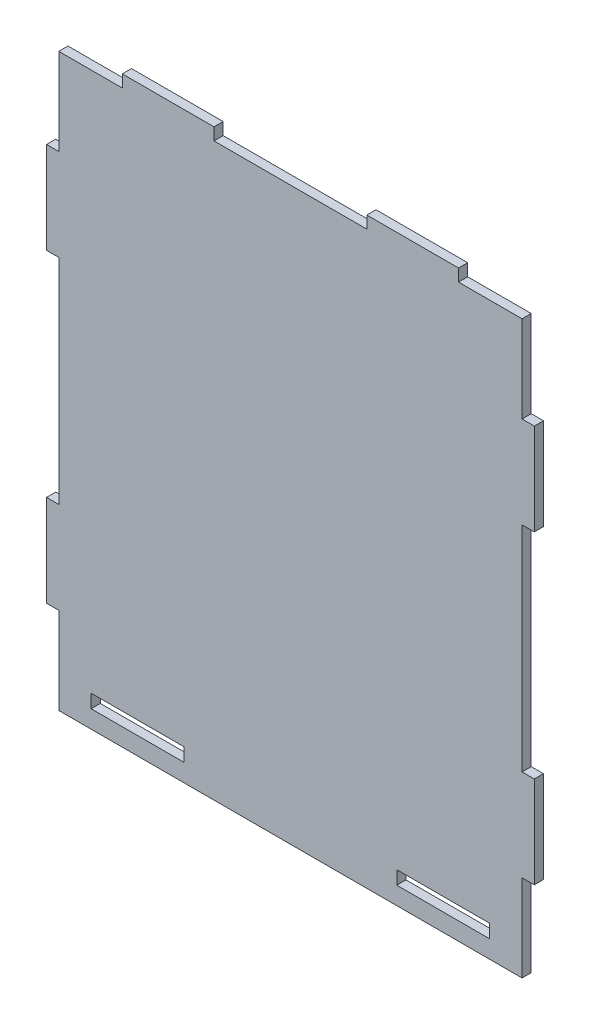
ISO-10303-21;
HEADER;
FILE_DESCRIPTION(('STEP AP214'),'2;1');
FILE_NAME('part.step','',(''),(''),'','','');
FILE_SCHEMA(('AUTOMOTIVE_DESIGN { 1 0 10303 214 1 1 1 1 }'));
ENDSEC;
DATA;
#1=APPLICATION_CONTEXT('core data for automotive mechanical design processes');
#2=APPLICATION_PROTOCOL_DEFINITION('international standard','automotive_design',2000,#1);
#3=PRODUCT_CONTEXT('',#1,'mechanical');
#4=PRODUCT('Part','Part','',(#3));
#5=PRODUCT_RELATED_PRODUCT_CATEGORY('part','',(#4));
#6=PRODUCT_DEFINITION_FORMATION('','',#4);
#7=PRODUCT_DEFINITION_CONTEXT('part definition',#1,'design');
#8=PRODUCT_DEFINITION('design','',#6,#7);
#9=PRODUCT_DEFINITION_SHAPE('','',#8);
#10=(LENGTH_UNIT() NAMED_UNIT(*) SI_UNIT(.MILLI.,.METRE.));
#11=(NAMED_UNIT(*) PLANE_ANGLE_UNIT() SI_UNIT($,.RADIAN.));
#12=(NAMED_UNIT(*) SI_UNIT($,.STERADIAN.) SOLID_ANGLE_UNIT());
#13=UNCERTAINTY_MEASURE_WITH_UNIT(LENGTH_MEASURE(1.E-05),#10,'distance_accuracy_value','');
#14=(GEOMETRIC_REPRESENTATION_CONTEXT(3) GLOBAL_UNCERTAINTY_ASSIGNED_CONTEXT((#13)) GLOBAL_UNIT_ASSIGNED_CONTEXT((#10,
#11,#12)) REPRESENTATION_CONTEXT('',''));
#15=CARTESIAN_POINT('',(0.,0.,0.));
#16=DIRECTION('',(0.,0.,1.));
#17=DIRECTION('',(1.,0.,0.));
#18=AXIS2_PLACEMENT_3D('',#15,#16,#17);
#19=CARTESIAN_POINT('',(0.,0.,3.));
#20=DIRECTION('',(0.,1.,0.));
#21=DIRECTION('',(0.,0.,1.));
#22=AXIS2_PLACEMENT_3D('',#19,#20,#21);
#23=PLANE('',#22);
#24=DIRECTION('',(1.,0.,0.));
#25=VECTOR('',#24,1.);
#26=CARTESIAN_POINT('',(0.,0.,0.));
#27=LINE('',#26,#25);
#28=CARTESIAN_POINT('',(0.,0.,0.));
#29=VERTEX_POINT('',#28);
#30=CARTESIAN_POINT('',(151.6,0.,0.));
#31=VERTEX_POINT('',#30);
#32=EDGE_CURVE('E332',#29,#31,#27,.T.);
#33=ORIENTED_EDGE('',*,*,#32,.T.);
#34=DIRECTION('',(0.,0.,-1.));
#35=VECTOR('',#34,1.);
#36=CARTESIAN_POINT('',(151.6,0.,3.));
#37=LINE('',#36,#35);
#38=CARTESIAN_POINT('',(151.6,0.,3.));
#39=VERTEX_POINT('',#38);
#40=EDGE_CURVE('E11',#39,#31,#37,.T.);
#41=ORIENTED_EDGE('',*,*,#40,.F.);
#42=DIRECTION('',(1.,0.,0.));
#43=VECTOR('',#42,1.);
#44=CARTESIAN_POINT('',(0.,0.,3.));
#45=LINE('',#44,#43);
#46=CARTESIAN_POINT('',(0.,0.,3.));
#47=VERTEX_POINT('',#46);
#48=EDGE_CURVE('E499',#47,#39,#45,.T.);
#49=ORIENTED_EDGE('',*,*,#48,.F.);
#50=DIRECTION('',(0.,0.,-1.));
#51=VECTOR('',#50,1.);
#52=CARTESIAN_POINT('',(0.,0.,3.));
#53=LINE('',#52,#51);
#54=EDGE_CURVE('E56',#47,#29,#53,.T.);
#55=ORIENTED_EDGE('',*,*,#54,.T.);
#56=EDGE_LOOP('',(#33,#41,#49,#55));
#57=FACE_BOUND('',#56,.T.);
#58=ADVANCED_FACE('F37',(#57),#23,.F.);
#59=CARTESIAN_POINT('',(151.6,0.,3.));
#60=DIRECTION('',(-1.,0.,0.));
#61=DIRECTION('',(0.,0.,1.));
#62=AXIS2_PLACEMENT_3D('',#59,#60,#61);
#63=PLANE('',#62);
#64=DIRECTION('',(0.,1.,0.));
#65=VECTOR('',#64,1.);
#66=CARTESIAN_POINT('',(151.6,0.,0.));
#67=LINE('',#66,#65);
#68=CARTESIAN_POINT('',(151.6,28.4,0.));
#69=VERTEX_POINT('',#68);
#70=EDGE_CURVE('E334',#31,#69,#67,.T.);
#71=ORIENTED_EDGE('',*,*,#70,.T.);
#72=DIRECTION('',(0.,0.,-1.));
#73=VECTOR('',#72,1.);
#74=CARTESIAN_POINT('',(151.6,28.4,3.));
#75=LINE('',#74,#73);
#76=CARTESIAN_POINT('',(151.6,28.4,3.));
#77=VERTEX_POINT('',#76);
#78=EDGE_CURVE('E47',#77,#69,#75,.T.);
#79=ORIENTED_EDGE('',*,*,#78,.F.);
#80=DIRECTION('',(0.,1.,0.));
#81=VECTOR('',#80,1.);
#82=CARTESIAN_POINT('',(151.6,0.,3.));
#83=LINE('',#82,#81);
#84=EDGE_CURVE('E501',#39,#77,#83,.T.);
#85=ORIENTED_EDGE('',*,*,#84,.F.);
#86=ORIENTED_EDGE('',*,*,#40,.T.);
#87=EDGE_LOOP('',(#71,#79,#85,#86));
#88=FACE_BOUND('',#87,.T.);
#89=ADVANCED_FACE('F592',(#88),#63,.F.);
#90=CARTESIAN_POINT('',(0.,28.4,3.));
#91=DIRECTION('',(0.,1.,0.));
#92=DIRECTION('',(0.,0.,1.));
#93=AXIS2_PLACEMENT_3D('',#90,#91,#92);
#94=PLANE('',#93);
#95=DIRECTION('',(1.,0.,0.));
#96=VECTOR('',#95,1.);
#97=CARTESIAN_POINT('',(0.,28.4,0.));
#98=LINE('',#97,#96);
#99=CARTESIAN_POINT('',(155.6,28.4,0.));
#100=VERTEX_POINT('',#99);
#101=EDGE_CURVE('E336',#69,#100,#98,.T.);
#102=ORIENTED_EDGE('',*,*,#101,.T.);
#103=DIRECTION('',(0.,0.,-1.));
#104=VECTOR('',#103,1.);
#105=CARTESIAN_POINT('',(155.6,28.4,3.));
#106=LINE('',#105,#104);
#107=CARTESIAN_POINT('',(155.6,28.4,3.));
#108=VERTEX_POINT('',#107);
#109=EDGE_CURVE('E446',#108,#100,#106,.T.);
#110=ORIENTED_EDGE('',*,*,#109,.F.);
#111=DIRECTION('',(1.,0.,0.));
#112=VECTOR('',#111,1.);
#113=CARTESIAN_POINT('',(0.,28.4,3.));
#114=LINE('',#113,#112);
#115=EDGE_CURVE('E503',#77,#108,#114,.T.);
#116=ORIENTED_EDGE('',*,*,#115,.F.);
#117=ORIENTED_EDGE('',*,*,#78,.T.);
#118=EDGE_LOOP('',(#102,#110,#116,#117));
#119=FACE_BOUND('',#118,.T.);
#120=ADVANCED_FACE('F597',(#119),#94,.F.);
#121=CARTESIAN_POINT('',(155.6,0.,3.));
#122=DIRECTION('',(1.,0.,0.));
#123=DIRECTION('',(0.,0.,-1.));
#124=AXIS2_PLACEMENT_3D('',#121,#122,#123);
#125=PLANE('',#124);
#126=DIRECTION('',(0.,-1.,0.));
#127=VECTOR('',#126,1.);
#128=CARTESIAN_POINT('',(155.6,0.,0.));
#129=LINE('',#128,#127);
#130=CARTESIAN_POINT('',(155.6,58.4,0.));
#131=VERTEX_POINT('',#130);
#132=EDGE_CURVE('E341',#131,#100,#129,.T.);
#133=ORIENTED_EDGE('',*,*,#132,.F.);
#134=DIRECTION('',(0.,0.,-1.));
#135=VECTOR('',#134,1.);
#136=CARTESIAN_POINT('',(155.6,58.4,3.));
#137=LINE('',#136,#135);
#138=CARTESIAN_POINT('',(155.6,58.4,3.));
#139=VERTEX_POINT('',#138);
#140=EDGE_CURVE('E444',#139,#131,#137,.T.);
#141=ORIENTED_EDGE('',*,*,#140,.F.);
#142=DIRECTION('',(0.,-1.,0.));
#143=VECTOR('',#142,1.);
#144=CARTESIAN_POINT('',(155.6,0.,3.));
#145=LINE('',#144,#143);
#146=EDGE_CURVE('E507',#139,#108,#145,.T.);
#147=ORIENTED_EDGE('',*,*,#146,.T.);
#148=ORIENTED_EDGE('',*,*,#109,.T.);
#149=EDGE_LOOP('',(#133,#141,#147,#148));
#150=FACE_BOUND('',#149,.T.);
#151=ADVANCED_FACE('F801',(#150),#125,.T.);
#152=CARTESIAN_POINT('',(0.,58.4,3.));
#153=DIRECTION('',(0.,1.,0.));
#154=DIRECTION('',(0.,0.,1.));
#155=AXIS2_PLACEMENT_3D('',#152,#153,#154);
#156=PLANE('',#155);
#157=DIRECTION('',(1.,0.,0.));
#158=VECTOR('',#157,1.);
#159=CARTESIAN_POINT('',(0.,58.4,0.));
#160=LINE('',#159,#158);
#161=CARTESIAN_POINT('',(151.6,58.4,0.));
#162=VERTEX_POINT('',#161);
#163=EDGE_CURVE('E344',#162,#131,#160,.T.);
#164=ORIENTED_EDGE('',*,*,#163,.F.);
#165=DIRECTION('',(0.,0.,-1.));
#166=VECTOR('',#165,1.);
#167=CARTESIAN_POINT('',(151.6,58.4,3.));
#168=LINE('',#167,#166);
#169=CARTESIAN_POINT('',(151.6,58.4,3.));
#170=VERTEX_POINT('',#169);
#171=EDGE_CURVE('E442',#170,#162,#168,.T.);
#172=ORIENTED_EDGE('',*,*,#171,.F.);
#173=DIRECTION('',(1.,0.,0.));
#174=VECTOR('',#173,1.);
#175=CARTESIAN_POINT('',(0.,58.4,3.));
#176=LINE('',#175,#174);
#177=EDGE_CURVE('E510',#170,#139,#176,.T.);
#178=ORIENTED_EDGE('',*,*,#177,.T.);
#179=ORIENTED_EDGE('',*,*,#140,.T.);
#180=EDGE_LOOP('',(#164,#172,#178,#179));
#181=FACE_BOUND('',#180,.T.);
#182=ADVANCED_FACE('F794',(#181),#156,.T.);
#183=CARTESIAN_POINT('',(151.6,128.4,0.));
#184=VERTEX_POINT('',#183);
#185=EDGE_CURVE('E338',#162,#184,#67,.T.);
#186=ORIENTED_EDGE('',*,*,#185,.T.);
#187=DIRECTION('',(0.,0.,-1.));
#188=VECTOR('',#187,1.);
#189=CARTESIAN_POINT('',(151.6,128.4,3.));
#190=LINE('',#189,#188);
#191=CARTESIAN_POINT('',(151.6,128.4,3.));
#192=VERTEX_POINT('',#191);
#193=EDGE_CURVE('E439',#192,#184,#190,.T.);
#194=ORIENTED_EDGE('',*,*,#193,.F.);
#195=EDGE_CURVE('E505',#170,#192,#83,.T.);
#196=ORIENTED_EDGE('',*,*,#195,.F.);
#197=ORIENTED_EDGE('',*,*,#171,.T.);
#198=EDGE_LOOP('',(#186,#194,#196,#197));
#199=FACE_BOUND('',#198,.T.);
#200=ADVANCED_FACE('F600',(#199),#63,.F.);
#201=CARTESIAN_POINT('',(0.,128.4,3.));
#202=DIRECTION('',(0.,1.,0.));
#203=DIRECTION('',(0.,0.,1.));
#204=AXIS2_PLACEMENT_3D('',#201,#202,#203);
#205=PLANE('',#204);
#206=DIRECTION('',(1.,0.,0.));
#207=VECTOR('',#206,1.);
#208=CARTESIAN_POINT('',(0.,128.4,0.));
#209=LINE('',#208,#207);
#210=CARTESIAN_POINT('',(155.6,128.4,0.));
#211=VERTEX_POINT('',#210);
#212=EDGE_CURVE('E347',#184,#211,#209,.T.);
#213=ORIENTED_EDGE('',*,*,#212,.T.);
#214=DIRECTION('',(0.,0.,-1.));
#215=VECTOR('',#214,1.);
#216=CARTESIAN_POINT('',(155.6,128.4,3.));
#217=LINE('',#216,#215);
#218=CARTESIAN_POINT('',(155.6,128.4,3.));
#219=VERTEX_POINT('',#218);
#220=EDGE_CURVE('E437',#219,#211,#217,.T.);
#221=ORIENTED_EDGE('',*,*,#220,.F.);
#222=DIRECTION('',(1.,0.,0.));
#223=VECTOR('',#222,1.);
#224=CARTESIAN_POINT('',(0.,128.4,3.));
#225=LINE('',#224,#223);
#226=EDGE_CURVE('E513',#192,#219,#225,.T.);
#227=ORIENTED_EDGE('',*,*,#226,.F.);
#228=ORIENTED_EDGE('',*,*,#193,.T.);
#229=EDGE_LOOP('',(#213,#221,#227,#228));
#230=FACE_BOUND('',#229,.T.);
#231=ADVANCED_FACE('F779',(#230),#205,.F.);
#232=CARTESIAN_POINT('',(155.6,0.,3.));
#233=DIRECTION('',(1.,0.,0.));
#234=DIRECTION('',(0.,0.,-1.));
#235=AXIS2_PLACEMENT_3D('',#232,#233,#234);
#236=PLANE('',#235);
#237=DIRECTION('',(0.,-1.,0.));
#238=VECTOR('',#237,1.);
#239=CARTESIAN_POINT('',(155.6,0.,0.));
#240=LINE('',#239,#238);
#241=CARTESIAN_POINT('',(155.6,158.4,0.));
#242=VERTEX_POINT('',#241);
#243=EDGE_CURVE('E350',#242,#211,#240,.T.);
#244=ORIENTED_EDGE('',*,*,#243,.F.);
#245=DIRECTION('',(0.,0.,-1.));
#246=VECTOR('',#245,1.);
#247=CARTESIAN_POINT('',(155.6,158.4,3.));
#248=LINE('',#247,#246);
#249=CARTESIAN_POINT('',(155.6,158.4,3.));
#250=VERTEX_POINT('',#249);
#251=EDGE_CURVE('E435',#250,#242,#248,.T.);
#252=ORIENTED_EDGE('',*,*,#251,.F.);
#253=DIRECTION('',(0.,-1.,0.));
#254=VECTOR('',#253,1.);
#255=CARTESIAN_POINT('',(155.6,0.,3.));
#256=LINE('',#255,#254);
#257=EDGE_CURVE('E515',#250,#219,#256,.T.);
#258=ORIENTED_EDGE('',*,*,#257,.T.);
#259=ORIENTED_EDGE('',*,*,#220,.T.);
#260=EDGE_LOOP('',(#244,#252,#258,#259));
#261=FACE_BOUND('',#260,.T.);
#262=ADVANCED_FACE('F771',(#261),#236,.T.);
#263=CARTESIAN_POINT('',(0.,158.4,3.));
#264=DIRECTION('',(0.,1.,0.));
#265=DIRECTION('',(0.,0.,1.));
#266=AXIS2_PLACEMENT_3D('',#263,#264,#265);
#267=PLANE('',#266);
#268=DIRECTION('',(1.,0.,0.));
#269=VECTOR('',#268,1.);
#270=CARTESIAN_POINT('',(0.,158.4,0.));
#271=LINE('',#270,#269);
#272=CARTESIAN_POINT('',(151.6,158.4,0.));
#273=VERTEX_POINT('',#272);
#274=EDGE_CURVE('E353',#273,#242,#271,.T.);
#275=ORIENTED_EDGE('',*,*,#274,.F.);
#276=DIRECTION('',(0.,0.,-1.));
#277=VECTOR('',#276,1.);
#278=CARTESIAN_POINT('',(151.6,158.4,3.));
#279=LINE('',#278,#277);
#280=CARTESIAN_POINT('',(151.6,158.4,3.));
#281=VERTEX_POINT('',#280);
#282=EDGE_CURVE('E433',#281,#273,#279,.T.);
#283=ORIENTED_EDGE('',*,*,#282,.F.);
#284=DIRECTION('',(1.,0.,0.));
#285=VECTOR('',#284,1.);
#286=CARTESIAN_POINT('',(0.,158.4,3.));
#287=LINE('',#286,#285);
#288=EDGE_CURVE('E518',#281,#250,#287,.T.);
#289=ORIENTED_EDGE('',*,*,#288,.T.);
#290=ORIENTED_EDGE('',*,*,#251,.T.);
#291=EDGE_LOOP('',(#275,#283,#289,#290));
#292=FACE_BOUND('',#291,.T.);
#293=ADVANCED_FACE('F764',(#292),#267,.T.);
#294=CARTESIAN_POINT('',(151.6,186.8,0.));
#295=VERTEX_POINT('',#294);
#296=EDGE_CURVE('E337',#273,#295,#67,.T.);
#297=ORIENTED_EDGE('',*,*,#296,.T.);
#298=DIRECTION('',(0.,0.,-1.));
#299=VECTOR('',#298,1.);
#300=CARTESIAN_POINT('',(151.6,186.8,3.));
#301=LINE('',#300,#299);
#302=CARTESIAN_POINT('',(151.6,186.8,3.));
#303=VERTEX_POINT('',#302);
#304=EDGE_CURVE('E431',#303,#295,#301,.T.);
#305=ORIENTED_EDGE('',*,*,#304,.F.);
#306=EDGE_CURVE('E504',#281,#303,#83,.T.);
#307=ORIENTED_EDGE('',*,*,#306,.F.);
#308=ORIENTED_EDGE('',*,*,#282,.T.);
#309=EDGE_LOOP('',(#297,#305,#307,#308));
#310=FACE_BOUND('',#309,.T.);
#311=ADVANCED_FACE('F601',(#310),#63,.F.);
#312=CARTESIAN_POINT('',(0.,186.8,3.));
#313=DIRECTION('',(0.,1.,0.));
#314=DIRECTION('',(0.,0.,1.));
#315=AXIS2_PLACEMENT_3D('',#312,#313,#314);
#316=PLANE('',#315);
#317=DIRECTION('',(1.,0.,0.));
#318=VECTOR('',#317,1.);
#319=CARTESIAN_POINT('',(0.,186.8,0.));
#320=LINE('',#319,#318);
#321=CARTESIAN_POINT('',(130.8,186.8,0.));
#322=VERTEX_POINT('',#321);
#323=EDGE_CURVE('E356',#322,#295,#320,.T.);
#324=ORIENTED_EDGE('',*,*,#323,.F.);
#325=DIRECTION('',(0.,0.,-1.));
#326=VECTOR('',#325,1.);
#327=CARTESIAN_POINT('',(130.8,186.8,3.));
#328=LINE('',#327,#326);
#329=CARTESIAN_POINT('',(130.8,186.8,3.));
#330=VERTEX_POINT('',#329);
#331=EDGE_CURVE('E429',#330,#322,#328,.T.);
#332=ORIENTED_EDGE('',*,*,#331,.F.);
#333=DIRECTION('',(1.,0.,0.));
#334=VECTOR('',#333,1.);
#335=CARTESIAN_POINT('',(0.,186.8,3.));
#336=LINE('',#335,#334);
#337=EDGE_CURVE('E521',#330,#303,#336,.T.);
#338=ORIENTED_EDGE('',*,*,#337,.T.);
#339=ORIENTED_EDGE('',*,*,#304,.T.);
#340=EDGE_LOOP('',(#324,#332,#338,#339));
#341=FACE_BOUND('',#340,.T.);
#342=ADVANCED_FACE('F698',(#341),#316,.T.);
#343=CARTESIAN_POINT('',(130.8,0.,3.));
#344=DIRECTION('',(-1.,0.,0.));
#345=DIRECTION('',(0.,0.,1.));
#346=AXIS2_PLACEMENT_3D('',#343,#344,#345);
#347=PLANE('',#346);
#348=DIRECTION('',(0.,1.,0.));
#349=VECTOR('',#348,1.);
#350=CARTESIAN_POINT('',(130.8,0.,0.));
#351=LINE('',#350,#349);
#352=CARTESIAN_POINT('',(130.8,190.8,0.));
#353=VERTEX_POINT('',#352);
#354=EDGE_CURVE('E359',#322,#353,#351,.T.);
#355=ORIENTED_EDGE('',*,*,#354,.T.);
#356=DIRECTION('',(0.,0.,-1.));
#357=VECTOR('',#356,1.);
#358=CARTESIAN_POINT('',(130.8,190.8,3.));
#359=LINE('',#358,#357);
#360=CARTESIAN_POINT('',(130.8,190.8,3.));
#361=VERTEX_POINT('',#360);
#362=EDGE_CURVE('E427',#361,#353,#359,.T.);
#363=ORIENTED_EDGE('',*,*,#362,.F.);
#364=DIRECTION('',(0.,1.,0.));
#365=VECTOR('',#364,1.);
#366=CARTESIAN_POINT('',(130.8,0.,3.));
#367=LINE('',#366,#365);
#368=EDGE_CURVE('E524',#330,#361,#367,.T.);
#369=ORIENTED_EDGE('',*,*,#368,.F.);
#370=ORIENTED_EDGE('',*,*,#331,.T.);
#371=EDGE_LOOP('',(#355,#363,#369,#370));
#372=FACE_BOUND('',#371,.T.);
#373=ADVANCED_FACE('F743',(#372),#347,.F.);
#374=CARTESIAN_POINT('',(0.,190.8,3.));
#375=DIRECTION('',(0.,1.,0.));
#376=DIRECTION('',(0.,0.,1.));
#377=AXIS2_PLACEMENT_3D('',#374,#375,#376);
#378=PLANE('',#377);
#379=DIRECTION('',(1.,0.,0.));
#380=VECTOR('',#379,1.);
#381=CARTESIAN_POINT('',(0.,190.8,0.));
#382=LINE('',#381,#380);
#383=CARTESIAN_POINT('',(100.8,190.8,0.));
#384=VERTEX_POINT('',#383);
#385=EDGE_CURVE('E364',#384,#353,#382,.T.);
#386=ORIENTED_EDGE('',*,*,#385,.F.);
#387=DIRECTION('',(0.,0.,-1.));
#388=VECTOR('',#387,1.);
#389=CARTESIAN_POINT('',(100.8,190.8,3.));
#390=LINE('',#389,#388);
#391=CARTESIAN_POINT('',(100.8,190.8,3.));
#392=VERTEX_POINT('',#391);
#393=EDGE_CURVE('E425',#392,#384,#390,.T.);
#394=ORIENTED_EDGE('',*,*,#393,.F.);
#395=DIRECTION('',(1.,0.,0.));
#396=VECTOR('',#395,1.);
#397=CARTESIAN_POINT('',(0.,190.8,3.));
#398=LINE('',#397,#396);
#399=EDGE_CURVE('E528',#392,#361,#398,.T.);
#400=ORIENTED_EDGE('',*,*,#399,.T.);
#401=ORIENTED_EDGE('',*,*,#362,.T.);
#402=EDGE_LOOP('',(#386,#394,#400,#401));
#403=FACE_BOUND('',#402,.T.);
#404=ADVANCED_FACE('F735',(#403),#378,.T.);
#405=CARTESIAN_POINT('',(100.8,0.,3.));
#406=DIRECTION('',(-1.,0.,0.));
#407=DIRECTION('',(0.,0.,1.));
#408=AXIS2_PLACEMENT_3D('',#405,#406,#407);
#409=PLANE('',#408);
#410=DIRECTION('',(0.,1.,0.));
#411=VECTOR('',#410,1.);
#412=CARTESIAN_POINT('',(100.8,0.,0.));
#413=LINE('',#412,#411);
#414=CARTESIAN_POINT('',(100.8,186.8,0.));
#415=VERTEX_POINT('',#414);
#416=EDGE_CURVE('E367',#415,#384,#413,.T.);
#417=ORIENTED_EDGE('',*,*,#416,.F.);
#418=DIRECTION('',(0.,0.,-1.));
#419=VECTOR('',#418,1.);
#420=CARTESIAN_POINT('',(100.8,186.8,3.));
#421=LINE('',#420,#419);
#422=CARTESIAN_POINT('',(100.8,186.8,3.));
#423=VERTEX_POINT('',#422);
#424=EDGE_CURVE('E423',#423,#415,#421,.T.);
#425=ORIENTED_EDGE('',*,*,#424,.F.);
#426=DIRECTION('',(0.,1.,0.));
#427=VECTOR('',#426,1.);
#428=CARTESIAN_POINT('',(100.8,0.,3.));
#429=LINE('',#428,#427);
#430=EDGE_CURVE('E531',#423,#392,#429,.T.);
#431=ORIENTED_EDGE('',*,*,#430,.T.);
#432=ORIENTED_EDGE('',*,*,#393,.T.);
#433=EDGE_LOOP('',(#417,#425,#431,#432));
#434=FACE_BOUND('',#433,.T.);
#435=ADVANCED_FACE('F728',(#434),#409,.T.);
#436=CARTESIAN_POINT('',(50.8,186.8,0.));
#437=VERTEX_POINT('',#436);
#438=EDGE_CURVE('E361',#437,#415,#320,.T.);
#439=ORIENTED_EDGE('',*,*,#438,.F.);
#440=DIRECTION('',(0.,0.,-1.));
#441=VECTOR('',#440,1.);
#442=CARTESIAN_POINT('',(50.8,186.8,3.));
#443=LINE('',#442,#441);
#444=CARTESIAN_POINT('',(50.8,186.8,3.));
#445=VERTEX_POINT('',#444);
#446=EDGE_CURVE('E421',#445,#437,#443,.T.);
#447=ORIENTED_EDGE('',*,*,#446,.F.);
#448=EDGE_CURVE('E526',#445,#423,#336,.T.);
#449=ORIENTED_EDGE('',*,*,#448,.T.);
#450=ORIENTED_EDGE('',*,*,#424,.T.);
#451=EDGE_LOOP('',(#439,#447,#449,#450));
#452=FACE_BOUND('',#451,.T.);
#453=ADVANCED_FACE('F699',(#452),#316,.T.);
#454=CARTESIAN_POINT('',(50.8,0.,3.));
#455=DIRECTION('',(-1.,0.,0.));
#456=DIRECTION('',(0.,0.,1.));
#457=AXIS2_PLACEMENT_3D('',#454,#455,#456);
#458=PLANE('',#457);
#459=DIRECTION('',(0.,1.,0.));
#460=VECTOR('',#459,1.);
#461=CARTESIAN_POINT('',(50.8,0.,0.));
#462=LINE('',#461,#460);
#463=CARTESIAN_POINT('',(50.8,190.8,0.));
#464=VERTEX_POINT('',#463);
#465=EDGE_CURVE('E370',#437,#464,#462,.T.);
#466=ORIENTED_EDGE('',*,*,#465,.T.);
#467=DIRECTION('',(0.,0.,-1.));
#468=VECTOR('',#467,1.);
#469=CARTESIAN_POINT('',(50.8,190.8,3.));
#470=LINE('',#469,#468);
#471=CARTESIAN_POINT('',(50.8,190.8,3.));
#472=VERTEX_POINT('',#471);
#473=EDGE_CURVE('E419',#472,#464,#470,.T.);
#474=ORIENTED_EDGE('',*,*,#473,.F.);
#475=DIRECTION('',(0.,1.,0.));
#476=VECTOR('',#475,1.);
#477=CARTESIAN_POINT('',(50.8,0.,3.));
#478=LINE('',#477,#476);
#479=EDGE_CURVE('E534',#445,#472,#478,.T.);
#480=ORIENTED_EDGE('',*,*,#479,.F.);
#481=ORIENTED_EDGE('',*,*,#446,.T.);
#482=EDGE_LOOP('',(#466,#474,#480,#481));
#483=FACE_BOUND('',#482,.T.);
#484=ADVANCED_FACE('F713',(#483),#458,.F.);
#485=CARTESIAN_POINT('',(0.,190.8,3.));
#486=DIRECTION('',(0.,1.,0.));
#487=DIRECTION('',(0.,0.,1.));
#488=AXIS2_PLACEMENT_3D('',#485,#486,#487);
#489=PLANE('',#488);
#490=DIRECTION('',(1.,0.,0.));
#491=VECTOR('',#490,1.);
#492=CARTESIAN_POINT('',(0.,190.8,0.));
#493=LINE('',#492,#491);
#494=CARTESIAN_POINT('',(20.8,190.8,0.));
#495=VERTEX_POINT('',#494);
#496=EDGE_CURVE('E373',#495,#464,#493,.T.);
#497=ORIENTED_EDGE('',*,*,#496,.F.);
#498=DIRECTION('',(0.,0.,-1.));
#499=VECTOR('',#498,1.);
#500=CARTESIAN_POINT('',(20.8,190.8,3.));
#501=LINE('',#500,#499);
#502=CARTESIAN_POINT('',(20.8,190.8,3.));
#503=VERTEX_POINT('',#502);
#504=EDGE_CURVE('E417',#503,#495,#501,.T.);
#505=ORIENTED_EDGE('',*,*,#504,.F.);
#506=DIRECTION('',(1.,0.,0.));
#507=VECTOR('',#506,1.);
#508=CARTESIAN_POINT('',(0.,190.8,3.));
#509=LINE('',#508,#507);
#510=EDGE_CURVE('E536',#503,#472,#509,.T.);
#511=ORIENTED_EDGE('',*,*,#510,.T.);
#512=ORIENTED_EDGE('',*,*,#473,.T.);
#513=EDGE_LOOP('',(#497,#505,#511,#512));
#514=FACE_BOUND('',#513,.T.);
#515=ADVANCED_FACE('F705',(#514),#489,.T.);
#516=CARTESIAN_POINT('',(20.8,0.,3.));
#517=DIRECTION('',(-1.,0.,0.));
#518=DIRECTION('',(0.,0.,1.));
#519=AXIS2_PLACEMENT_3D('',#516,#517,#518);
#520=PLANE('',#519);
#521=DIRECTION('',(0.,1.,0.));
#522=VECTOR('',#521,1.);
#523=CARTESIAN_POINT('',(20.8,0.,0.));
#524=LINE('',#523,#522);
#525=CARTESIAN_POINT('',(20.8,186.8,0.));
#526=VERTEX_POINT('',#525);
#527=EDGE_CURVE('E376',#526,#495,#524,.T.);
#528=ORIENTED_EDGE('',*,*,#527,.F.);
#529=DIRECTION('',(0.,0.,-1.));
#530=VECTOR('',#529,1.);
#531=CARTESIAN_POINT('',(20.8,186.8,3.));
#532=LINE('',#531,#530);
#533=CARTESIAN_POINT('',(20.8,186.8,3.));
#534=VERTEX_POINT('',#533);
#535=EDGE_CURVE('E415',#534,#526,#532,.T.);
#536=ORIENTED_EDGE('',*,*,#535,.F.);
#537=DIRECTION('',(0.,1.,0.));
#538=VECTOR('',#537,1.);
#539=CARTESIAN_POINT('',(20.8,0.,3.));
#540=LINE('',#539,#538);
#541=EDGE_CURVE('E539',#534,#503,#540,.T.);
#542=ORIENTED_EDGE('',*,*,#541,.T.);
#543=ORIENTED_EDGE('',*,*,#504,.T.);
#544=EDGE_LOOP('',(#528,#536,#542,#543));
#545=FACE_BOUND('',#544,.T.);
#546=ADVANCED_FACE('F695',(#545),#520,.T.);
#547=CARTESIAN_POINT('',(0.,186.8,0.));
#548=VERTEX_POINT('',#547);
#549=EDGE_CURVE('E360',#548,#526,#320,.T.);
#550=ORIENTED_EDGE('',*,*,#549,.F.);
#551=DIRECTION('',(0.,0.,-1.));
#552=VECTOR('',#551,1.);
#553=CARTESIAN_POINT('',(0.,186.8,3.));
#554=LINE('',#553,#552);
#555=CARTESIAN_POINT('',(0.,186.8,3.));
#556=VERTEX_POINT('',#555);
#557=EDGE_CURVE('E413',#556,#548,#554,.T.);
#558=ORIENTED_EDGE('',*,*,#557,.F.);
#559=EDGE_CURVE('E525',#556,#534,#336,.T.);
#560=ORIENTED_EDGE('',*,*,#559,.T.);
#561=ORIENTED_EDGE('',*,*,#535,.T.);
#562=EDGE_LOOP('',(#550,#558,#560,#561));
#563=FACE_BOUND('',#562,.T.);
#564=ADVANCED_FACE('F688',(#563),#316,.T.);
#565=CARTESIAN_POINT('',(0.,0.,3.));
#566=DIRECTION('',(-1.,0.,0.));
#567=DIRECTION('',(0.,0.,1.));
#568=AXIS2_PLACEMENT_3D('',#565,#566,#567);
#569=PLANE('',#568);
#570=DIRECTION('',(0.,1.,0.));
#571=VECTOR('',#570,1.);
#572=CARTESIAN_POINT('',(0.,0.,0.));
#573=LINE('',#572,#571);
#574=CARTESIAN_POINT('',(0.,158.4,0.));
#575=VERTEX_POINT('',#574);
#576=EDGE_CURVE('E379',#575,#548,#573,.T.);
#577=ORIENTED_EDGE('',*,*,#576,.F.);
#578=DIRECTION('',(0.,0.,-1.));
#579=VECTOR('',#578,1.);
#580=CARTESIAN_POINT('',(0.,158.4,3.));
#581=LINE('',#580,#579);
#582=CARTESIAN_POINT('',(0.,158.4,3.));
#583=VERTEX_POINT('',#582);
#584=EDGE_CURVE('E411',#583,#575,#581,.T.);
#585=ORIENTED_EDGE('',*,*,#584,.F.);
#586=DIRECTION('',(0.,1.,0.));
#587=VECTOR('',#586,1.);
#588=CARTESIAN_POINT('',(0.,0.,3.));
#589=LINE('',#588,#587);
#590=EDGE_CURVE('E306',#583,#556,#589,.T.);
#591=ORIENTED_EDGE('',*,*,#590,.T.);
#592=ORIENTED_EDGE('',*,*,#557,.T.);
#593=EDGE_LOOP('',(#577,#585,#591,#592));
#594=FACE_BOUND('',#593,.T.);
#595=ADVANCED_FACE('F660',(#594),#569,.T.);
#596=CARTESIAN_POINT('',(-2.19824158875781E-12,158.4,3.));
#597=DIRECTION('',(0.,-1.,0.));
#598=DIRECTION('',(1.,0.,0.));
#599=AXIS2_PLACEMENT_3D('',#596,#597,#598);
#600=PLANE('',#599);
#601=DIRECTION('',(-1.,0.,0.));
#602=VECTOR('',#601,1.);
#603=CARTESIAN_POINT('',(-2.19824158875781E-12,158.4,0.));
#604=LINE('',#603,#602);
#605=CARTESIAN_POINT('',(-4.,158.4,0.));
#606=VERTEX_POINT('',#605);
#607=EDGE_CURVE('E382',#575,#606,#604,.T.);
#608=ORIENTED_EDGE('',*,*,#607,.T.);
#609=DIRECTION('',(0.,0.,-1.));
#610=VECTOR('',#609,1.);
#611=CARTESIAN_POINT('',(-4.,158.4,3.));
#612=LINE('',#611,#610);
#613=CARTESIAN_POINT('',(-4.,158.4,3.));
#614=VERTEX_POINT('',#613);
#615=EDGE_CURVE('E408',#614,#606,#612,.T.);
#616=ORIENTED_EDGE('',*,*,#615,.F.);
#617=DIRECTION('',(-1.,0.,0.));
#618=VECTOR('',#617,1.);
#619=CARTESIAN_POINT('',(-2.19824158875781E-12,158.4,3.));
#620=LINE('',#619,#618);
#621=EDGE_CURVE('E543',#583,#614,#620,.T.);
#622=ORIENTED_EDGE('',*,*,#621,.F.);
#623=ORIENTED_EDGE('',*,*,#584,.T.);
#624=EDGE_LOOP('',(#608,#616,#622,#623));
#625=FACE_BOUND('',#624,.T.);
#626=ADVANCED_FACE('F673',(#625),#600,.F.);
#627=CARTESIAN_POINT('',(-4.,0.,3.));
#628=DIRECTION('',(1.,0.,0.));
#629=DIRECTION('',(0.,0.,-1.));
#630=AXIS2_PLACEMENT_3D('',#627,#628,#629);
#631=PLANE('',#630);
#632=DIRECTION('',(0.,-1.,0.));
#633=VECTOR('',#632,1.);
#634=CARTESIAN_POINT('',(-4.,0.,0.));
#635=LINE('',#634,#633);
#636=CARTESIAN_POINT('',(-4.,128.4,0.));
#637=VERTEX_POINT('',#636);
#638=EDGE_CURVE('E386',#606,#637,#635,.T.);
#639=ORIENTED_EDGE('',*,*,#638,.T.);
#640=DIRECTION('',(0.,0.,-1.));
#641=VECTOR('',#640,1.);
#642=CARTESIAN_POINT('',(-4.,128.4,3.));
#643=LINE('',#642,#641);
#644=CARTESIAN_POINT('',(-4.,128.4,3.));
#645=VERTEX_POINT('',#644);
#646=EDGE_CURVE('E406',#645,#637,#643,.T.);
#647=ORIENTED_EDGE('',*,*,#646,.F.);
#648=DIRECTION('',(0.,-1.,0.));
#649=VECTOR('',#648,1.);
#650=CARTESIAN_POINT('',(-4.,0.,3.));
#651=LINE('',#650,#649);
#652=EDGE_CURVE('E545',#614,#645,#651,.T.);
#653=ORIENTED_EDGE('',*,*,#652,.F.);
#654=ORIENTED_EDGE('',*,*,#615,.T.);
#655=EDGE_LOOP('',(#639,#647,#653,#654));
#656=FACE_BOUND('',#655,.T.);
#657=ADVANCED_FACE('F666',(#656),#631,.F.);
#658=CARTESIAN_POINT('',(8.90953977261688E-13,128.4,3.));
#659=DIRECTION('',(0.,-1.,0.));
#660=DIRECTION('',(1.,0.,0.));
#661=AXIS2_PLACEMENT_3D('',#658,#659,#660);
#662=PLANE('',#661);
#663=DIRECTION('',(-1.,0.,0.));
#664=VECTOR('',#663,1.);
#665=CARTESIAN_POINT('',(8.90953977261688E-13,128.4,0.));
#666=LINE('',#665,#664);
#667=CARTESIAN_POINT('',(0.,128.4,0.));
#668=VERTEX_POINT('',#667);
#669=EDGE_CURVE('E389',#668,#637,#666,.T.);
#670=ORIENTED_EDGE('',*,*,#669,.F.);
#671=DIRECTION('',(0.,0.,-1.));
#672=VECTOR('',#671,1.);
#673=CARTESIAN_POINT('',(0.,128.4,3.));
#674=LINE('',#673,#672);
#675=CARTESIAN_POINT('',(0.,128.4,3.));
#676=VERTEX_POINT('',#675);
#677=EDGE_CURVE('E404',#676,#668,#674,.T.);
#678=ORIENTED_EDGE('',*,*,#677,.F.);
#679=DIRECTION('',(-1.,0.,0.));
#680=VECTOR('',#679,1.);
#681=CARTESIAN_POINT('',(8.90953977261688E-13,128.4,3.));
#682=LINE('',#681,#680);
#683=EDGE_CURVE('E547',#676,#645,#682,.T.);
#684=ORIENTED_EDGE('',*,*,#683,.T.);
#685=ORIENTED_EDGE('',*,*,#646,.T.);
#686=EDGE_LOOP('',(#670,#678,#684,#685));
#687=FACE_BOUND('',#686,.T.);
#688=ADVANCED_FACE('F558',(#687),#662,.T.);
#689=CARTESIAN_POINT('',(0.,58.4,0.));
#690=VERTEX_POINT('',#689);
#691=EDGE_CURVE('E384',#690,#668,#573,.T.);
#692=ORIENTED_EDGE('',*,*,#691,.F.);
#693=DIRECTION('',(0.,0.,-1.));
#694=VECTOR('',#693,1.);
#695=CARTESIAN_POINT('',(0.,58.4,3.));
#696=LINE('',#695,#694);
#697=CARTESIAN_POINT('',(0.,58.4,3.));
#698=VERTEX_POINT('',#697);
#699=EDGE_CURVE('E402',#698,#690,#696,.T.);
#700=ORIENTED_EDGE('',*,*,#699,.F.);
#701=EDGE_CURVE('E305',#698,#676,#589,.T.);
#702=ORIENTED_EDGE('',*,*,#701,.T.);
#703=ORIENTED_EDGE('',*,*,#677,.T.);
#704=EDGE_LOOP('',(#692,#700,#702,#703));
#705=FACE_BOUND('',#704,.T.);
#706=ADVANCED_FACE('F552',(#705),#569,.T.);
#707=CARTESIAN_POINT('',(0.,58.4,3.));
#708=DIRECTION('',(0.,-1.,0.));
#709=DIRECTION('',(0.,0.,-1.));
#710=AXIS2_PLACEMENT_3D('',#707,#708,#709);
#711=PLANE('',#710);
#712=DIRECTION('',(-1.,0.,0.));
#713=VECTOR('',#712,1.);
#714=CARTESIAN_POINT('',(0.,58.4,0.));
#715=LINE('',#714,#713);
#716=CARTESIAN_POINT('',(-4.,58.4,0.));
#717=VERTEX_POINT('',#716);
#718=EDGE_CURVE('E392',#690,#717,#715,.T.);
#719=ORIENTED_EDGE('',*,*,#718,.T.);
#720=DIRECTION('',(0.,0.,-1.));
#721=VECTOR('',#720,1.);
#722=CARTESIAN_POINT('',(-4.,58.4,3.));
#723=LINE('',#722,#721);
#724=CARTESIAN_POINT('',(-4.,58.4,3.));
#725=VERTEX_POINT('',#724);
#726=EDGE_CURVE('E287',#725,#717,#723,.T.);
#727=ORIENTED_EDGE('',*,*,#726,.F.);
#728=DIRECTION('',(-1.,0.,0.));
#729=VECTOR('',#728,1.);
#730=CARTESIAN_POINT('',(0.,58.4,3.));
#731=LINE('',#730,#729);
#732=EDGE_CURVE('E297',#698,#725,#731,.T.);
#733=ORIENTED_EDGE('',*,*,#732,.F.);
#734=ORIENTED_EDGE('',*,*,#699,.T.);
#735=EDGE_LOOP('',(#719,#727,#733,#734));
#736=FACE_BOUND('',#735,.T.);
#737=ADVANCED_FACE('F646',(#736),#711,.F.);
#738=CARTESIAN_POINT('',(-4.,0.,3.));
#739=DIRECTION('',(-1.,0.,0.));
#740=DIRECTION('',(0.,0.,1.));
#741=AXIS2_PLACEMENT_3D('',#738,#739,#740);
#742=PLANE('',#741);
#743=DIRECTION('',(0.,1.,0.));
#744=VECTOR('',#743,1.);
#745=CARTESIAN_POINT('',(-4.,0.,0.));
#746=LINE('',#745,#744);
#747=CARTESIAN_POINT('',(-4.,28.4,0.));
#748=VERTEX_POINT('',#747);
#749=EDGE_CURVE('E283',#748,#717,#746,.T.);
#750=ORIENTED_EDGE('',*,*,#749,.F.);
#751=DIRECTION('',(0.,0.,-1.));
#752=VECTOR('',#751,1.);
#753=CARTESIAN_POINT('',(-4.,28.4,3.));
#754=LINE('',#753,#752);
#755=CARTESIAN_POINT('',(-4.,28.4,3.));
#756=VERTEX_POINT('',#755);
#757=EDGE_CURVE('E278',#756,#748,#754,.T.);
#758=ORIENTED_EDGE('',*,*,#757,.F.);
#759=DIRECTION('',(0.,1.,0.));
#760=VECTOR('',#759,1.);
#761=CARTESIAN_POINT('',(-4.,0.,3.));
#762=LINE('',#761,#760);
#763=EDGE_CURVE('E281',#756,#725,#762,.T.);
#764=ORIENTED_EDGE('',*,*,#763,.T.);
#765=ORIENTED_EDGE('',*,*,#726,.T.);
#766=EDGE_LOOP('',(#750,#758,#764,#765));
#767=FACE_BOUND('',#766,.T.);
#768=ADVANCED_FACE('F280',(#767),#742,.T.);
#769=CARTESIAN_POINT('',(0.,28.4,3.));
#770=DIRECTION('',(0.,-1.,0.));
#771=DIRECTION('',(0.,0.,-1.));
#772=AXIS2_PLACEMENT_3D('',#769,#770,#771);
#773=PLANE('',#772);
#774=DIRECTION('',(-1.,0.,0.));
#775=VECTOR('',#774,1.);
#776=CARTESIAN_POINT('',(0.,28.4,0.));
#777=LINE('',#776,#775);
#778=CARTESIAN_POINT('',(0.,28.4,0.));
#779=VERTEX_POINT('',#778);
#780=EDGE_CURVE('E396',#779,#748,#777,.T.);
#781=ORIENTED_EDGE('',*,*,#780,.F.);
#782=DIRECTION('',(0.,0.,-1.));
#783=VECTOR('',#782,1.);
#784=CARTESIAN_POINT('',(0.,28.4,3.));
#785=LINE('',#784,#783);
#786=CARTESIAN_POINT('',(0.,28.4,3.));
#787=VERTEX_POINT('',#786);
#788=EDGE_CURVE('E166',#787,#779,#785,.T.);
#789=ORIENTED_EDGE('',*,*,#788,.F.);
#790=DIRECTION('',(-1.,0.,0.));
#791=VECTOR('',#790,1.);
#792=CARTESIAN_POINT('',(0.,28.4,3.));
#793=LINE('',#792,#791);
#794=EDGE_CURVE('E294',#787,#756,#793,.T.);
#795=ORIENTED_EDGE('',*,*,#794,.T.);
#796=ORIENTED_EDGE('',*,*,#757,.T.);
#797=EDGE_LOOP('',(#781,#789,#795,#796));
#798=FACE_BOUND('',#797,.T.);
#799=ADVANCED_FACE('F300',(#798),#773,.T.);
#800=CARTESIAN_POINT('',(41.,0.,3.));
#801=DIRECTION('',(-1.,0.,0.));
#802=DIRECTION('',(0.,0.,1.));
#803=AXIS2_PLACEMENT_3D('',#800,#801,#802);
#804=PLANE('',#803);
#805=DIRECTION('',(0.,1.,0.));
#806=VECTOR('',#805,1.);
#807=CARTESIAN_POINT('',(41.,0.,0.));
#808=LINE('',#807,#806);
#809=CARTESIAN_POINT('',(41.,5.8,0.));
#810=VERTEX_POINT('',#809);
#811=CARTESIAN_POINT('',(41.,10.2,0.));
#812=VERTEX_POINT('',#811);
#813=EDGE_CURVE('E320',#810,#812,#808,.T.);
#814=ORIENTED_EDGE('',*,*,#813,.F.);
#815=DIRECTION('',(0.,0.,-1.));
#816=VECTOR('',#815,1.);
#817=CARTESIAN_POINT('',(41.,5.8,3.));
#818=LINE('',#817,#816);
#819=CARTESIAN_POINT('',(41.,5.8,3.));
#820=VERTEX_POINT('',#819);
#821=EDGE_CURVE('E399',#820,#810,#818,.T.);
#822=ORIENTED_EDGE('',*,*,#821,.F.);
#823=DIRECTION('',(0.,1.,0.));
#824=VECTOR('',#823,1.);
#825=CARTESIAN_POINT('',(41.,0.,3.));
#826=LINE('',#825,#824);
#827=CARTESIAN_POINT('',(41.,10.2,3.));
#828=VERTEX_POINT('',#827);
#829=EDGE_CURVE('E483',#820,#828,#826,.T.);
#830=ORIENTED_EDGE('',*,*,#829,.T.);
#831=DIRECTION('',(0.,0.,-1.));
#832=VECTOR('',#831,1.);
#833=CARTESIAN_POINT('',(41.,10.2,3.));
#834=LINE('',#833,#832);
#835=EDGE_CURVE('E450',#828,#812,#834,.T.);
#836=ORIENTED_EDGE('',*,*,#835,.T.);
#837=EDGE_LOOP('',(#814,#822,#830,#836));
#838=FACE_BOUND('',#837,.T.);
#839=ADVANCED_FACE('F585',(#838),#804,.T.);
#840=CARTESIAN_POINT('',(0.,5.8,3.));
#841=DIRECTION('',(0.,1.,0.));
#842=DIRECTION('',(0.,0.,1.));
#843=AXIS2_PLACEMENT_3D('',#840,#841,#842);
#844=PLANE('',#843);
#845=DIRECTION('',(1.,0.,0.));
#846=VECTOR('',#845,1.);
#847=CARTESIAN_POINT('',(0.,5.8,0.));
#848=LINE('',#847,#846);
#849=CARTESIAN_POINT('',(10.6,5.8,0.));
#850=VERTEX_POINT('',#849);
#851=EDGE_CURVE('E323',#850,#810,#848,.T.);
#852=ORIENTED_EDGE('',*,*,#851,.F.);
#853=DIRECTION('',(0.,0.,-1.));
#854=VECTOR('',#853,1.);
#855=CARTESIAN_POINT('',(10.6,5.8,3.));
#856=LINE('',#855,#854);
#857=CARTESIAN_POINT('',(10.6,5.8,3.));
#858=VERTEX_POINT('',#857);
#859=EDGE_CURVE('E455',#858,#850,#856,.T.);
#860=ORIENTED_EDGE('',*,*,#859,.F.);
#861=DIRECTION('',(1.,0.,0.));
#862=VECTOR('',#861,1.);
#863=CARTESIAN_POINT('',(0.,5.8,3.));
#864=LINE('',#863,#862);
#865=EDGE_CURVE('E487',#858,#820,#864,.T.);
#866=ORIENTED_EDGE('',*,*,#865,.T.);
#867=ORIENTED_EDGE('',*,*,#821,.T.);
#868=EDGE_LOOP('',(#852,#860,#866,#867));
#869=FACE_BOUND('',#868,.T.);
#870=ADVANCED_FACE('F576',(#869),#844,.T.);
#871=CARTESIAN_POINT('',(10.6,0.,3.));
#872=DIRECTION('',(-1.,0.,0.));
#873=DIRECTION('',(0.,0.,1.));
#874=AXIS2_PLACEMENT_3D('',#871,#872,#873);
#875=PLANE('',#874);
#876=DIRECTION('',(0.,1.,0.));
#877=VECTOR('',#876,1.);
#878=CARTESIAN_POINT('',(10.6,0.,0.));
#879=LINE('',#878,#877);
#880=CARTESIAN_POINT('',(10.6,10.2,0.));
#881=VERTEX_POINT('',#880);
#882=EDGE_CURVE('E326',#850,#881,#879,.T.);
#883=ORIENTED_EDGE('',*,*,#882,.T.);
#884=DIRECTION('',(0.,0.,-1.));
#885=VECTOR('',#884,1.);
#886=CARTESIAN_POINT('',(10.6,10.2,3.));
#887=LINE('',#886,#885);
#888=CARTESIAN_POINT('',(10.6,10.2,3.));
#889=VERTEX_POINT('',#888);
#890=EDGE_CURVE('E452',#889,#881,#887,.T.);
#891=ORIENTED_EDGE('',*,*,#890,.F.);
#892=DIRECTION('',(0.,1.,0.));
#893=VECTOR('',#892,1.);
#894=CARTESIAN_POINT('',(10.6,0.,3.));
#895=LINE('',#894,#893);
#896=EDGE_CURVE('E494',#858,#889,#895,.T.);
#897=ORIENTED_EDGE('',*,*,#896,.F.);
#898=ORIENTED_EDGE('',*,*,#859,.T.);
#899=EDGE_LOOP('',(#883,#891,#897,#898));
#900=FACE_BOUND('',#899,.T.);
#901=ADVANCED_FACE('F582',(#900),#875,.F.);
#902=CARTESIAN_POINT('',(141.,0.,3.));
#903=DIRECTION('',(-1.,0.,0.));
#904=DIRECTION('',(0.,0.,1.));
#905=AXIS2_PLACEMENT_3D('',#902,#903,#904);
#906=PLANE('',#905);
#907=DIRECTION('',(0.,1.,0.));
#908=VECTOR('',#907,1.);
#909=CARTESIAN_POINT('',(141.,0.,0.));
#910=LINE('',#909,#908);
#911=CARTESIAN_POINT('',(141.,5.8,0.));
#912=VERTEX_POINT('',#911);
#913=CARTESIAN_POINT('',(141.,10.2,0.));
#914=VERTEX_POINT('',#913);
#915=EDGE_CURVE('E309',#912,#914,#910,.T.);
#916=ORIENTED_EDGE('',*,*,#915,.F.);
#917=DIRECTION('',(0.,0.,-1.));
#918=VECTOR('',#917,1.);
#919=CARTESIAN_POINT('',(141.,5.8,3.));
#920=LINE('',#919,#918);
#921=CARTESIAN_POINT('',(141.,5.8,3.));
#922=VERTEX_POINT('',#921);
#923=EDGE_CURVE('E41',#922,#912,#920,.T.);
#924=ORIENTED_EDGE('',*,*,#923,.F.);
#925=DIRECTION('',(0.,1.,0.));
#926=VECTOR('',#925,1.);
#927=CARTESIAN_POINT('',(141.,0.,3.));
#928=LINE('',#927,#926);
#929=CARTESIAN_POINT('',(141.,10.2,3.));
#930=VERTEX_POINT('',#929);
#931=EDGE_CURVE('E564',#922,#930,#928,.T.);
#932=ORIENTED_EDGE('',*,*,#931,.T.);
#933=DIRECTION('',(0.,0.,-1.));
#934=VECTOR('',#933,1.);
#935=CARTESIAN_POINT('',(141.,10.2,3.));
#936=LINE('',#935,#934);
#937=EDGE_CURVE('E303',#930,#914,#936,.T.);
#938=ORIENTED_EDGE('',*,*,#937,.T.);
#939=EDGE_LOOP('',(#916,#924,#932,#938));
#940=FACE_BOUND('',#939,.T.);
#941=ADVANCED_FACE('F39',(#940),#906,.T.);
#942=CARTESIAN_POINT('',(0.,5.79999999999999,3.));
#943=DIRECTION('',(0.,1.,0.));
#944=DIRECTION('',(-1.,0.,0.));
#945=AXIS2_PLACEMENT_3D('',#942,#943,#944);
#946=PLANE('',#945);
#947=DIRECTION('',(1.,0.,0.));
#948=VECTOR('',#947,1.);
#949=CARTESIAN_POINT('',(0.,5.79999999999999,0.));
#950=LINE('',#949,#948);
#951=CARTESIAN_POINT('',(110.6,5.8,0.));
#952=VERTEX_POINT('',#951);
#953=EDGE_CURVE('E312',#952,#912,#950,.T.);
#954=ORIENTED_EDGE('',*,*,#953,.F.);
#955=DIRECTION('',(0.,0.,-1.));
#956=VECTOR('',#955,1.);
#957=CARTESIAN_POINT('',(110.6,5.8,3.));
#958=LINE('',#957,#956);
#959=CARTESIAN_POINT('',(110.6,5.8,3.));
#960=VERTEX_POINT('',#959);
#961=EDGE_CURVE('E461',#960,#952,#958,.T.);
#962=ORIENTED_EDGE('',*,*,#961,.F.);
#963=DIRECTION('',(1.,0.,0.));
#964=VECTOR('',#963,1.);
#965=CARTESIAN_POINT('',(0.,5.79999999999999,3.));
#966=LINE('',#965,#964);
#967=EDGE_CURVE('E470',#960,#922,#966,.T.);
#968=ORIENTED_EDGE('',*,*,#967,.T.);
#969=ORIENTED_EDGE('',*,*,#923,.T.);
#970=EDGE_LOOP('',(#954,#962,#968,#969));
#971=FACE_BOUND('',#970,.T.);
#972=ADVANCED_FACE('F468',(#971),#946,.T.);
#973=CARTESIAN_POINT('',(110.6,0.,3.));
#974=DIRECTION('',(-1.,0.,0.));
#975=DIRECTION('',(0.,0.,1.));
#976=AXIS2_PLACEMENT_3D('',#973,#974,#975);
#977=PLANE('',#976);
#978=DIRECTION('',(0.,1.,0.));
#979=VECTOR('',#978,1.);
#980=CARTESIAN_POINT('',(110.6,0.,0.));
#981=LINE('',#980,#979);
#982=CARTESIAN_POINT('',(110.6,10.2,0.));
#983=VERTEX_POINT('',#982);
#984=EDGE_CURVE('E315',#952,#983,#981,.T.);
#985=ORIENTED_EDGE('',*,*,#984,.T.);
#986=DIRECTION('',(0.,0.,-1.));
#987=VECTOR('',#986,1.);
#988=CARTESIAN_POINT('',(110.6,10.2,3.));
#989=LINE('',#988,#987);
#990=CARTESIAN_POINT('',(110.6,10.2,3.));
#991=VERTEX_POINT('',#990);
#992=EDGE_CURVE('E459',#991,#983,#989,.T.);
#993=ORIENTED_EDGE('',*,*,#992,.F.);
#994=DIRECTION('',(0.,1.,0.));
#995=VECTOR('',#994,1.);
#996=CARTESIAN_POINT('',(110.6,0.,3.));
#997=LINE('',#996,#995);
#998=EDGE_CURVE('E484',#960,#991,#997,.T.);
#999=ORIENTED_EDGE('',*,*,#998,.F.);
#1000=ORIENTED_EDGE('',*,*,#961,.T.);
#1001=EDGE_LOOP('',(#985,#993,#999,#1000));
#1002=FACE_BOUND('',#1001,.T.);
#1003=ADVANCED_FACE('F477',(#1002),#977,.F.);
#1004=CARTESIAN_POINT('',(0.,10.2,3.));
#1005=DIRECTION('',(0.,1.,0.));
#1006=DIRECTION('',(0.,0.,1.));
#1007=AXIS2_PLACEMENT_3D('',#1004,#1005,#1006);
#1008=PLANE('',#1007);
#1009=DIRECTION('',(1.,0.,0.));
#1010=VECTOR('',#1009,1.);
#1011=CARTESIAN_POINT('',(0.,10.2,0.));
#1012=LINE('',#1011,#1010);
#1013=EDGE_CURVE('E329',#881,#812,#1012,.T.);
#1014=ORIENTED_EDGE('',*,*,#1013,.T.);
#1015=ORIENTED_EDGE('',*,*,#835,.F.);
#1016=DIRECTION('',(1.,0.,0.));
#1017=VECTOR('',#1016,1.);
#1018=CARTESIAN_POINT('',(0.,10.2,3.));
#1019=LINE('',#1018,#1017);
#1020=EDGE_CURVE('E497',#889,#828,#1019,.T.);
#1021=ORIENTED_EDGE('',*,*,#1020,.F.);
#1022=ORIENTED_EDGE('',*,*,#890,.T.);
#1023=EDGE_LOOP('',(#1014,#1015,#1021,#1022));
#1024=FACE_BOUND('',#1023,.T.);
#1025=ADVANCED_FACE('F584',(#1024),#1008,.F.);
#1026=CARTESIAN_POINT('',(0.,10.2,3.));
#1027=DIRECTION('',(0.,1.,0.));
#1028=DIRECTION('',(-1.,0.,0.));
#1029=AXIS2_PLACEMENT_3D('',#1026,#1027,#1028);
#1030=PLANE('',#1029);
#1031=DIRECTION('',(1.,0.,0.));
#1032=VECTOR('',#1031,1.);
#1033=CARTESIAN_POINT('',(0.,10.2,0.));
#1034=LINE('',#1033,#1032);
#1035=EDGE_CURVE('E317',#983,#914,#1034,.T.);
#1036=ORIENTED_EDGE('',*,*,#1035,.T.);
#1037=ORIENTED_EDGE('',*,*,#937,.F.);
#1038=DIRECTION('',(1.,0.,0.));
#1039=VECTOR('',#1038,1.);
#1040=CARTESIAN_POINT('',(0.,10.2,3.));
#1041=LINE('',#1040,#1039);
#1042=EDGE_CURVE('E481',#991,#930,#1041,.T.);
#1043=ORIENTED_EDGE('',*,*,#1042,.F.);
#1044=ORIENTED_EDGE('',*,*,#992,.T.);
#1045=EDGE_LOOP('',(#1036,#1037,#1043,#1044));
#1046=FACE_BOUND('',#1045,.T.);
#1047=ADVANCED_FACE('F480',(#1046),#1030,.F.);
#1048=EDGE_CURVE('E383',#29,#779,#573,.T.);
#1049=ORIENTED_EDGE('',*,*,#1048,.F.);
#1050=ORIENTED_EDGE('',*,*,#54,.F.);
#1051=EDGE_CURVE('E301',#47,#787,#589,.T.);
#1052=ORIENTED_EDGE('',*,*,#1051,.T.);
#1053=ORIENTED_EDGE('',*,*,#788,.T.);
#1054=EDGE_LOOP('',(#1049,#1050,#1052,#1053));
#1055=FACE_BOUND('',#1054,.T.);
#1056=ADVANCED_FACE('F568',(#1055),#569,.T.);
#1057=CARTESIAN_POINT('',(0.,0.,3.));
#1058=DIRECTION('',(0.,0.,1.));
#1059=DIRECTION('',(1.,0.,0.));
#1060=AXIS2_PLACEMENT_3D('',#1057,#1058,#1059);
#1061=PLANE('',#1060);
#1062=ORIENTED_EDGE('',*,*,#931,.F.);
#1063=ORIENTED_EDGE('',*,*,#967,.F.);
#1064=ORIENTED_EDGE('',*,*,#998,.T.);
#1065=ORIENTED_EDGE('',*,*,#1042,.T.);
#1066=EDGE_LOOP('',(#1062,#1063,#1064,#1065));
#1067=FACE_BOUND('',#1066,.T.);
#1068=ORIENTED_EDGE('',*,*,#829,.F.);
#1069=ORIENTED_EDGE('',*,*,#865,.F.);
#1070=ORIENTED_EDGE('',*,*,#896,.T.);
#1071=ORIENTED_EDGE('',*,*,#1020,.T.);
#1072=EDGE_LOOP('',(#1068,#1069,#1070,#1071));
#1073=FACE_BOUND('',#1072,.T.);
#1074=ORIENTED_EDGE('',*,*,#48,.T.);
#1075=ORIENTED_EDGE('',*,*,#84,.T.);
#1076=ORIENTED_EDGE('',*,*,#115,.T.);
#1077=ORIENTED_EDGE('',*,*,#146,.F.);
#1078=ORIENTED_EDGE('',*,*,#177,.F.);
#1079=ORIENTED_EDGE('',*,*,#195,.T.);
#1080=ORIENTED_EDGE('',*,*,#226,.T.);
#1081=ORIENTED_EDGE('',*,*,#257,.F.);
#1082=ORIENTED_EDGE('',*,*,#288,.F.);
#1083=ORIENTED_EDGE('',*,*,#306,.T.);
#1084=ORIENTED_EDGE('',*,*,#337,.F.);
#1085=ORIENTED_EDGE('',*,*,#368,.T.);
#1086=ORIENTED_EDGE('',*,*,#399,.F.);
#1087=ORIENTED_EDGE('',*,*,#430,.F.);
#1088=ORIENTED_EDGE('',*,*,#448,.F.);
#1089=ORIENTED_EDGE('',*,*,#479,.T.);
#1090=ORIENTED_EDGE('',*,*,#510,.F.);
#1091=ORIENTED_EDGE('',*,*,#541,.F.);
#1092=ORIENTED_EDGE('',*,*,#559,.F.);
#1093=ORIENTED_EDGE('',*,*,#590,.F.);
#1094=ORIENTED_EDGE('',*,*,#621,.T.);
#1095=ORIENTED_EDGE('',*,*,#652,.T.);
#1096=ORIENTED_EDGE('',*,*,#683,.F.);
#1097=ORIENTED_EDGE('',*,*,#701,.F.);
#1098=ORIENTED_EDGE('',*,*,#732,.T.);
#1099=ORIENTED_EDGE('',*,*,#763,.F.);
#1100=ORIENTED_EDGE('',*,*,#794,.F.);
#1101=ORIENTED_EDGE('',*,*,#1051,.F.);
#1102=EDGE_LOOP('',(#1074,#1075,#1076,#1077,#1078,#1079,#1080,#1081,#1082,#1083,#1084,#1085,
#1086,#1087,#1088,#1089,#1090,#1091,#1092,#1093,#1094,#1095,#1096,#1097,#1098,#1099,#1100,#1101));
#1103=FACE_BOUND('',#1102,.T.);
#1104=ADVANCED_FACE('F292',(#1067,#1073,#1103),#1061,.T.);
#1105=CARTESIAN_POINT('',(0.,0.,0.));
#1106=DIRECTION('',(0.,0.,1.));
#1107=DIRECTION('',(1.,0.,0.));
#1108=AXIS2_PLACEMENT_3D('',#1105,#1106,#1107);
#1109=PLANE('',#1108);
#1110=ORIENTED_EDGE('',*,*,#915,.T.);
#1111=ORIENTED_EDGE('',*,*,#1035,.F.);
#1112=ORIENTED_EDGE('',*,*,#984,.F.);
#1113=ORIENTED_EDGE('',*,*,#953,.T.);
#1114=EDGE_LOOP('',(#1110,#1111,#1112,#1113));
#1115=FACE_BOUND('',#1114,.T.);
#1116=ORIENTED_EDGE('',*,*,#813,.T.);
#1117=ORIENTED_EDGE('',*,*,#1013,.F.);
#1118=ORIENTED_EDGE('',*,*,#882,.F.);
#1119=ORIENTED_EDGE('',*,*,#851,.T.);
#1120=EDGE_LOOP('',(#1116,#1117,#1118,#1119));
#1121=FACE_BOUND('',#1120,.T.);
#1122=ORIENTED_EDGE('',*,*,#32,.F.);
#1123=ORIENTED_EDGE('',*,*,#1048,.T.);
#1124=ORIENTED_EDGE('',*,*,#780,.T.);
#1125=ORIENTED_EDGE('',*,*,#749,.T.);
#1126=ORIENTED_EDGE('',*,*,#718,.F.);
#1127=ORIENTED_EDGE('',*,*,#691,.T.);
#1128=ORIENTED_EDGE('',*,*,#669,.T.);
#1129=ORIENTED_EDGE('',*,*,#638,.F.);
#1130=ORIENTED_EDGE('',*,*,#607,.F.);
#1131=ORIENTED_EDGE('',*,*,#576,.T.);
#1132=ORIENTED_EDGE('',*,*,#549,.T.);
#1133=ORIENTED_EDGE('',*,*,#527,.T.);
#1134=ORIENTED_EDGE('',*,*,#496,.T.);
#1135=ORIENTED_EDGE('',*,*,#465,.F.);
#1136=ORIENTED_EDGE('',*,*,#438,.T.);
#1137=ORIENTED_EDGE('',*,*,#416,.T.);
#1138=ORIENTED_EDGE('',*,*,#385,.T.);
#1139=ORIENTED_EDGE('',*,*,#354,.F.);
#1140=ORIENTED_EDGE('',*,*,#323,.T.);
#1141=ORIENTED_EDGE('',*,*,#296,.F.);
#1142=ORIENTED_EDGE('',*,*,#274,.T.);
#1143=ORIENTED_EDGE('',*,*,#243,.T.);
#1144=ORIENTED_EDGE('',*,*,#212,.F.);
#1145=ORIENTED_EDGE('',*,*,#185,.F.);
#1146=ORIENTED_EDGE('',*,*,#163,.T.);
#1147=ORIENTED_EDGE('',*,*,#132,.T.);
#1148=ORIENTED_EDGE('',*,*,#101,.F.);
#1149=ORIENTED_EDGE('',*,*,#70,.F.);
#1150=EDGE_LOOP('',(#1122,#1123,#1124,#1125,#1126,#1127,#1128,#1129,#1130,#1131,#1132,#1133,
#1134,#1135,#1136,#1137,#1138,#1139,#1140,#1141,#1142,#1143,#1144,#1145,#1146,#1147,#1148,#1149));
#1151=FACE_BOUND('',#1150,.T.);
#1152=ADVANCED_FACE('F474',(#1115,#1121,#1151),#1109,.F.);
#1153=CLOSED_SHELL('',(#58,#89,#120,#151,#182,#200,#231,#262,#293,#311,#342,#373,#404,#435,#453,
#484,#515,#546,#564,#595,#626,#657,#688,#706,#737,#768,#799,#839,#870,#901,#941,#972,#1003,
#1025,#1047,#1056,#1104,#1152));
#1154=MANIFOLD_SOLID_BREP('B2',#1153);
#1155=ADVANCED_BREP_SHAPE_REPRESENTATION('',(#18,#1154),#14);
#1156=SHAPE_DEFINITION_REPRESENTATION(#9,#1155);
ENDSEC;
END-ISO-10303-21;
